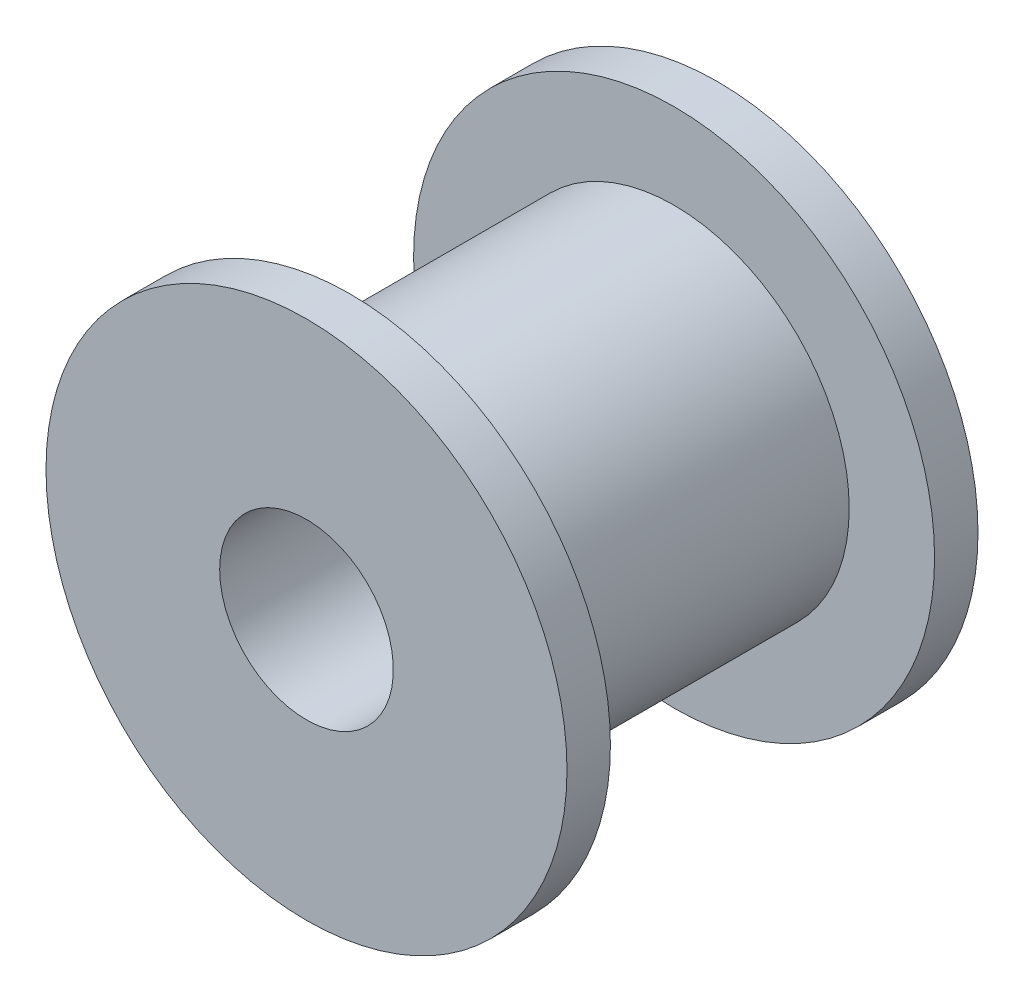
ISO-10303-21;
HEADER;
FILE_DESCRIPTION(('STEP AP214'),'2;1');
FILE_NAME('part.step','',(''),(''),'','','');
FILE_SCHEMA(('AUTOMOTIVE_DESIGN { 1 0 10303 214 1 1 1 1 }'));
ENDSEC;
DATA;
#1=APPLICATION_CONTEXT('core data for automotive mechanical design processes');
#2=APPLICATION_PROTOCOL_DEFINITION('international standard','automotive_design',2000,#1);
#3=PRODUCT_CONTEXT('',#1,'mechanical');
#4=PRODUCT('Part','Part','',(#3));
#5=PRODUCT_RELATED_PRODUCT_CATEGORY('part','',(#4));
#6=PRODUCT_DEFINITION_FORMATION('','',#4);
#7=PRODUCT_DEFINITION_CONTEXT('part definition',#1,'design');
#8=PRODUCT_DEFINITION('design','',#6,#7);
#9=PRODUCT_DEFINITION_SHAPE('','',#8);
#10=(LENGTH_UNIT() NAMED_UNIT(*) SI_UNIT(.MILLI.,.METRE.));
#11=(NAMED_UNIT(*) PLANE_ANGLE_UNIT() SI_UNIT($,.RADIAN.));
#12=(NAMED_UNIT(*) SI_UNIT($,.STERADIAN.) SOLID_ANGLE_UNIT());
#13=UNCERTAINTY_MEASURE_WITH_UNIT(LENGTH_MEASURE(1.E-05),#10,'distance_accuracy_value','');
#14=(GEOMETRIC_REPRESENTATION_CONTEXT(3) GLOBAL_UNCERTAINTY_ASSIGNED_CONTEXT((#13)) GLOBAL_UNIT_ASSIGNED_CONTEXT((#10,
#11,#12)) REPRESENTATION_CONTEXT('',''));
#15=CARTESIAN_POINT('',(0.,0.,0.));
#16=DIRECTION('',(0.,0.,1.));
#17=DIRECTION('',(1.,0.,0.));
#18=AXIS2_PLACEMENT_3D('',#15,#16,#17);
#19=CARTESIAN_POINT('',(3.,0.,-7.1));
#20=DIRECTION('',(0.,0.,1.));
#21=DIRECTION('',(1.,0.,0.));
#22=AXIS2_PLACEMENT_3D('',#19,#20,#21);
#23=PLANE('',#22);
#24=CARTESIAN_POINT('',(0.,0.,-7.1));
#25=DIRECTION('',(0.,0.,-1.));
#26=DIRECTION('',(-1.,0.,0.));
#27=AXIS2_PLACEMENT_3D('',#24,#25,#26);
#28=CIRCLE('',#27,3.);
#29=CARTESIAN_POINT('',(-3.,0.,-7.1));
#30=VERTEX_POINT('',#29);
#31=EDGE_CURVE('E72',#30,#30,#28,.T.);
#32=ORIENTED_EDGE('',*,*,#31,.F.);
#33=EDGE_LOOP('',(#32));
#34=FACE_BOUND('',#33,.T.);
#35=CARTESIAN_POINT('',(0.,0.,-7.1));
#36=DIRECTION('',(0.,0.,-1.));
#37=DIRECTION('',(-1.,0.,0.));
#38=AXIS2_PLACEMENT_3D('',#35,#36,#37);
#39=CIRCLE('',#38,9.);
#40=CARTESIAN_POINT('',(-9.,0.,-7.1));
#41=VERTEX_POINT('',#40);
#42=EDGE_CURVE('E10',#41,#41,#39,.T.);
#43=ORIENTED_EDGE('',*,*,#42,.T.);
#44=EDGE_LOOP('',(#43));
#45=FACE_BOUND('',#44,.T.);
#46=ADVANCED_FACE('F37',(#34,#45),#23,.F.);
#47=CARTESIAN_POINT('',(0.,0.,-16.2670807453416));
#48=DIRECTION('',(0.,0.,-1.));
#49=DIRECTION('',(-1.,0.,0.));
#50=AXIS2_PLACEMENT_3D('',#47,#48,#49);
#51=CYLINDRICAL_SURFACE('',#50,9.);
#52=ORIENTED_EDGE('',*,*,#42,.F.);
#53=EDGE_LOOP('',(#52));
#54=FACE_BOUND('',#53,.T.);
#55=CARTESIAN_POINT('',(0.,0.,-5.6));
#56=DIRECTION('',(0.,0.,-1.));
#57=DIRECTION('',(-1.,0.,0.));
#58=AXIS2_PLACEMENT_3D('',#55,#56,#57);
#59=CIRCLE('',#58,9.);
#60=CARTESIAN_POINT('',(-9.,0.,-5.6));
#61=VERTEX_POINT('',#60);
#62=EDGE_CURVE('E44',#61,#61,#59,.T.);
#63=ORIENTED_EDGE('',*,*,#62,.T.);
#64=EDGE_LOOP('',(#63));
#65=FACE_BOUND('',#64,.T.);
#66=ADVANCED_FACE('F80',(#54,#65),#51,.T.);
#67=CARTESIAN_POINT('',(9.,0.,-5.6));
#68=DIRECTION('',(0.,0.,-1.));
#69=DIRECTION('',(-1.,0.,0.));
#70=AXIS2_PLACEMENT_3D('',#67,#68,#69);
#71=PLANE('',#70);
#72=ORIENTED_EDGE('',*,*,#62,.F.);
#73=EDGE_LOOP('',(#72));
#74=FACE_BOUND('',#73,.T.);
#75=CARTESIAN_POINT('',(0.,0.,-5.60000000000001));
#76=DIRECTION('',(0.,0.,-1.));
#77=DIRECTION('',(-1.,0.,0.));
#78=AXIS2_PLACEMENT_3D('',#75,#76,#77);
#79=CIRCLE('',#78,6.05);
#80=CARTESIAN_POINT('',(-6.05,0.,-5.60000000000001));
#81=VERTEX_POINT('',#80);
#82=EDGE_CURVE('E49',#81,#81,#79,.T.);
#83=ORIENTED_EDGE('',*,*,#82,.T.);
#84=EDGE_LOOP('',(#83));
#85=FACE_BOUND('',#84,.T.);
#86=ADVANCED_FACE('F84',(#74,#85),#71,.F.);
#87=CARTESIAN_POINT('',(0.,0.,-16.2670807453416));
#88=DIRECTION('',(0.,0.,-1.));
#89=DIRECTION('',(-1.,0.,0.));
#90=AXIS2_PLACEMENT_3D('',#87,#88,#89);
#91=CYLINDRICAL_SURFACE('',#90,6.05);
#92=ORIENTED_EDGE('',*,*,#82,.F.);
#93=EDGE_LOOP('',(#92));
#94=FACE_BOUND('',#93,.T.);
#95=CARTESIAN_POINT('',(0.,0.,5.60000000000001));
#96=DIRECTION('',(0.,0.,-1.));
#97=DIRECTION('',(-1.,0.,0.));
#98=AXIS2_PLACEMENT_3D('',#95,#96,#97);
#99=CIRCLE('',#98,6.05);
#100=CARTESIAN_POINT('',(-6.05,0.,5.60000000000001));
#101=VERTEX_POINT('',#100);
#102=EDGE_CURVE('E54',#101,#101,#99,.T.);
#103=ORIENTED_EDGE('',*,*,#102,.T.);
#104=EDGE_LOOP('',(#103));
#105=FACE_BOUND('',#104,.T.);
#106=ADVANCED_FACE('F89',(#94,#105),#91,.T.);
#107=CARTESIAN_POINT('',(9.,0.,5.6));
#108=DIRECTION('',(0.,0.,1.));
#109=DIRECTION('',(1.,0.,0.));
#110=AXIS2_PLACEMENT_3D('',#107,#108,#109);
#111=PLANE('',#110);
#112=ORIENTED_EDGE('',*,*,#102,.F.);
#113=EDGE_LOOP('',(#112));
#114=FACE_BOUND('',#113,.T.);
#115=CARTESIAN_POINT('',(0.,0.,5.6));
#116=DIRECTION('',(0.,0.,-1.));
#117=DIRECTION('',(-1.,0.,0.));
#118=AXIS2_PLACEMENT_3D('',#115,#116,#117);
#119=CIRCLE('',#118,9.);
#120=CARTESIAN_POINT('',(-9.,0.,5.6));
#121=VERTEX_POINT('',#120);
#122=EDGE_CURVE('E60',#121,#121,#119,.T.);
#123=ORIENTED_EDGE('',*,*,#122,.T.);
#124=EDGE_LOOP('',(#123));
#125=FACE_BOUND('',#124,.T.);
#126=ADVANCED_FACE('F95',(#114,#125),#111,.F.);
#127=CARTESIAN_POINT('',(0.,0.,-16.2670807453416));
#128=DIRECTION('',(0.,0.,-1.));
#129=DIRECTION('',(-1.,0.,0.));
#130=AXIS2_PLACEMENT_3D('',#127,#128,#129);
#131=CYLINDRICAL_SURFACE('',#130,9.);
#132=ORIENTED_EDGE('',*,*,#122,.F.);
#133=EDGE_LOOP('',(#132));
#134=FACE_BOUND('',#133,.T.);
#135=CARTESIAN_POINT('',(0.,0.,7.1));
#136=DIRECTION('',(0.,0.,-1.));
#137=DIRECTION('',(-1.,0.,0.));
#138=AXIS2_PLACEMENT_3D('',#135,#136,#137);
#139=CIRCLE('',#138,9.);
#140=CARTESIAN_POINT('',(-9.,0.,7.1));
#141=VERTEX_POINT('',#140);
#142=EDGE_CURVE('E64',#141,#141,#139,.T.);
#143=ORIENTED_EDGE('',*,*,#142,.T.);
#144=EDGE_LOOP('',(#143));
#145=FACE_BOUND('',#144,.T.);
#146=ADVANCED_FACE('F99',(#134,#145),#131,.T.);
#147=CARTESIAN_POINT('',(3.,0.,7.1));
#148=DIRECTION('',(0.,0.,-1.));
#149=DIRECTION('',(-1.,0.,0.));
#150=AXIS2_PLACEMENT_3D('',#147,#148,#149);
#151=PLANE('',#150);
#152=ORIENTED_EDGE('',*,*,#142,.F.);
#153=EDGE_LOOP('',(#152));
#154=FACE_BOUND('',#153,.T.);
#155=CARTESIAN_POINT('',(0.,0.,7.1));
#156=DIRECTION('',(0.,0.,-1.));
#157=DIRECTION('',(-1.,0.,0.));
#158=AXIS2_PLACEMENT_3D('',#155,#156,#157);
#159=CIRCLE('',#158,3.);
#160=CARTESIAN_POINT('',(-3.,0.,7.1));
#161=VERTEX_POINT('',#160);
#162=EDGE_CURVE('E68',#161,#161,#159,.T.);
#163=ORIENTED_EDGE('',*,*,#162,.T.);
#164=EDGE_LOOP('',(#163));
#165=FACE_BOUND('',#164,.T.);
#166=ADVANCED_FACE('F103',(#154,#165),#151,.F.);
#167=CARTESIAN_POINT('',(0.,0.,-16.2670807453416));
#168=DIRECTION('',(0.,0.,-1.));
#169=DIRECTION('',(-1.,0.,0.));
#170=AXIS2_PLACEMENT_3D('',#167,#168,#169);
#171=CYLINDRICAL_SURFACE('',#170,3.);
#172=ORIENTED_EDGE('',*,*,#162,.F.);
#173=EDGE_LOOP('',(#172));
#174=FACE_BOUND('',#173,.T.);
#175=ORIENTED_EDGE('',*,*,#31,.T.);
#176=EDGE_LOOP('',(#175));
#177=FACE_BOUND('',#176,.T.);
#178=ADVANCED_FACE('F77',(#174,#177),#171,.F.);
#179=CLOSED_SHELL('',(#46,#66,#86,#106,#126,#146,#166,#178));
#180=MANIFOLD_SOLID_BREP('B2',#179);
#181=ADVANCED_BREP_SHAPE_REPRESENTATION('',(#18,#180),#14);
#182=SHAPE_DEFINITION_REPRESENTATION(#9,#181);
ENDSEC;
END-ISO-10303-21;
